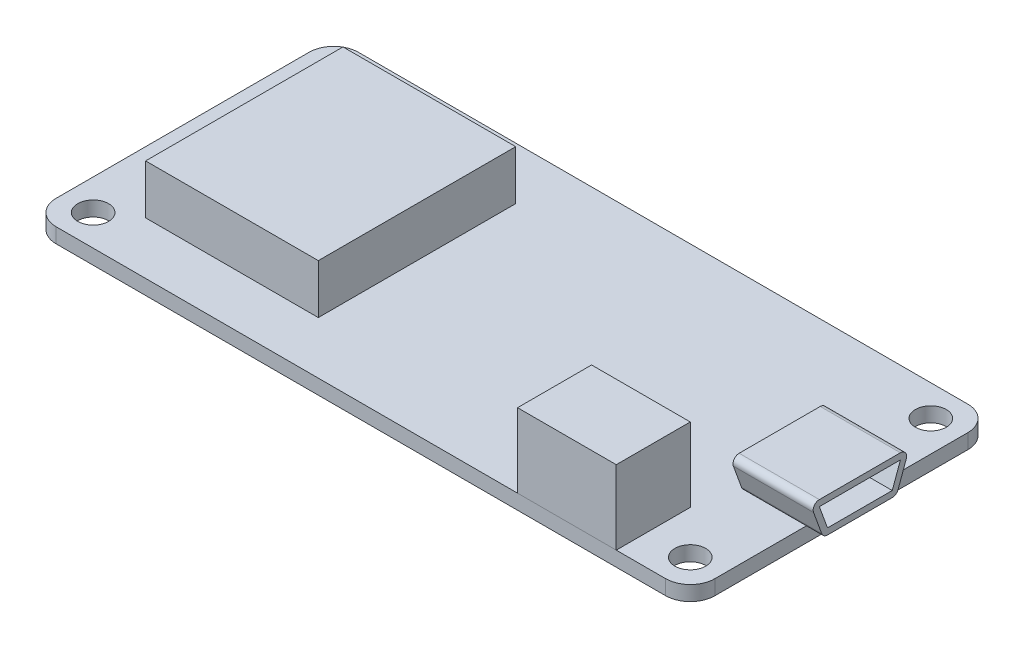
ISO-10303-21;
HEADER;
FILE_DESCRIPTION(('STEP AP214'),'2;1');
FILE_NAME('part.step','',(''),(''),'','','');
FILE_SCHEMA(('AUTOMOTIVE_DESIGN { 1 0 10303 214 1 1 1 1 }'));
ENDSEC;
DATA;
#1=APPLICATION_CONTEXT('core data for automotive mechanical design processes');
#2=APPLICATION_PROTOCOL_DEFINITION('international standard','automotive_design',2000,#1);
#3=PRODUCT_CONTEXT('',#1,'mechanical');
#4=PRODUCT('Part','Part','',(#3));
#5=PRODUCT_RELATED_PRODUCT_CATEGORY('part','',(#4));
#6=PRODUCT_DEFINITION_FORMATION('','',#4);
#7=PRODUCT_DEFINITION_CONTEXT('part definition',#1,'design');
#8=PRODUCT_DEFINITION('design','',#6,#7);
#9=PRODUCT_DEFINITION_SHAPE('','',#8);
#10=(LENGTH_UNIT() NAMED_UNIT(*) SI_UNIT(.MILLI.,.METRE.));
#11=(NAMED_UNIT(*) PLANE_ANGLE_UNIT() SI_UNIT($,.RADIAN.));
#12=(NAMED_UNIT(*) SI_UNIT($,.STERADIAN.) SOLID_ANGLE_UNIT());
#13=UNCERTAINTY_MEASURE_WITH_UNIT(LENGTH_MEASURE(1.E-05),#10,'distance_accuracy_value','');
#14=(GEOMETRIC_REPRESENTATION_CONTEXT(3) GLOBAL_UNCERTAINTY_ASSIGNED_CONTEXT((#13)) GLOBAL_UNIT_ASSIGNED_CONTEXT((#10,
#11,#12)) REPRESENTATION_CONTEXT('',''));
#15=CARTESIAN_POINT('',(0.,0.,0.));
#16=DIRECTION('',(0.,0.,1.));
#17=DIRECTION('',(1.,0.,0.));
#18=AXIS2_PLACEMENT_3D('',#15,#16,#17);
#19=CARTESIAN_POINT('',(47.4,7.2,0.));
#20=DIRECTION('',(-1.,0.,0.));
#21=DIRECTION('',(0.,0.,1.));
#22=AXIS2_PLACEMENT_3D('',#19,#20,#21);
#23=PLANE('',#22);
#24=DIRECTION('',(0.,0.,-1.));
#25=VECTOR('',#24,1.);
#26=CARTESIAN_POINT('',(47.4,1.2,0.));
#27=LINE('',#26,#25);
#28=CARTESIAN_POINT('',(47.4,1.2,0.));
#29=VERTEX_POINT('',#28);
#30=CARTESIAN_POINT('',(47.4,1.2,-6.));
#31=VERTEX_POINT('',#30);
#32=EDGE_CURVE('E110',#29,#31,#27,.T.);
#33=ORIENTED_EDGE('',*,*,#32,.T.);
#34=DIRECTION('',(0.,-1.,0.));
#35=VECTOR('',#34,1.);
#36=CARTESIAN_POINT('',(47.4,7.2,-6.));
#37=LINE('',#36,#35);
#38=CARTESIAN_POINT('',(47.4,7.2,-6.));
#39=VERTEX_POINT('',#38);
#40=EDGE_CURVE('E12',#39,#31,#37,.T.);
#41=ORIENTED_EDGE('',*,*,#40,.F.);
#42=DIRECTION('',(0.,0.,-1.));
#43=VECTOR('',#42,1.);
#44=CARTESIAN_POINT('',(47.4,7.2,0.));
#45=LINE('',#44,#43);
#46=CARTESIAN_POINT('',(47.4,7.2,0.));
#47=VERTEX_POINT('',#46);
#48=EDGE_CURVE('E98',#47,#39,#45,.T.);
#49=ORIENTED_EDGE('',*,*,#48,.F.);
#50=DIRECTION('',(0.,-1.,0.));
#51=VECTOR('',#50,1.);
#52=CARTESIAN_POINT('',(47.4,7.2,0.));
#53=LINE('',#52,#51);
#54=EDGE_CURVE('E106',#47,#29,#53,.T.);
#55=ORIENTED_EDGE('',*,*,#54,.T.);
#56=EDGE_LOOP('',(#33,#41,#49,#55));
#57=FACE_BOUND('',#56,.T.);
#58=ADVANCED_FACE('F47',(#57),#23,.F.);
#59=CARTESIAN_POINT('',(47.4,7.2,-6.));
#60=DIRECTION('',(0.,0.,1.));
#61=DIRECTION('',(1.,0.,0.));
#62=AXIS2_PLACEMENT_3D('',#59,#60,#61);
#63=PLANE('',#62);
#64=DIRECTION('',(-1.,0.,0.));
#65=VECTOR('',#64,1.);
#66=CARTESIAN_POINT('',(47.4,1.2,-6.));
#67=LINE('',#66,#65);
#68=CARTESIAN_POINT('',(39.4,1.2,-6.));
#69=VERTEX_POINT('',#68);
#70=EDGE_CURVE('E102',#31,#69,#67,.T.);
#71=ORIENTED_EDGE('',*,*,#70,.T.);
#72=DIRECTION('',(0.,-1.,0.));
#73=VECTOR('',#72,1.);
#74=CARTESIAN_POINT('',(39.4,7.2,-6.));
#75=LINE('',#74,#73);
#76=CARTESIAN_POINT('',(39.4,7.2,-6.));
#77=VERTEX_POINT('',#76);
#78=EDGE_CURVE('E55',#77,#69,#75,.T.);
#79=ORIENTED_EDGE('',*,*,#78,.F.);
#80=DIRECTION('',(-1.,0.,0.));
#81=VECTOR('',#80,1.);
#82=CARTESIAN_POINT('',(47.4,7.2,-6.));
#83=LINE('',#82,#81);
#84=EDGE_CURVE('E93',#39,#77,#83,.T.);
#85=ORIENTED_EDGE('',*,*,#84,.F.);
#86=ORIENTED_EDGE('',*,*,#40,.T.);
#87=EDGE_LOOP('',(#71,#79,#85,#86));
#88=FACE_BOUND('',#87,.T.);
#89=ADVANCED_FACE('F101',(#88),#63,.F.);
#90=CARTESIAN_POINT('',(39.4,7.2,0.));
#91=DIRECTION('',(1.,0.,0.));
#92=DIRECTION('',(0.,0.,-1.));
#93=AXIS2_PLACEMENT_3D('',#90,#91,#92);
#94=PLANE('',#93);
#95=DIRECTION('',(0.,0.,1.));
#96=VECTOR('',#95,1.);
#97=CARTESIAN_POINT('',(39.4,1.2,0.));
#98=LINE('',#97,#96);
#99=CARTESIAN_POINT('',(39.4,1.2,0.));
#100=VERTEX_POINT('',#99);
#101=EDGE_CURVE('E80',#69,#100,#98,.T.);
#102=ORIENTED_EDGE('',*,*,#101,.T.);
#103=DIRECTION('',(0.,-1.,0.));
#104=VECTOR('',#103,1.);
#105=CARTESIAN_POINT('',(39.4,7.2,0.));
#106=LINE('',#105,#104);
#107=CARTESIAN_POINT('',(39.4,7.2,0.));
#108=VERTEX_POINT('',#107);
#109=EDGE_CURVE('E103',#108,#100,#106,.T.);
#110=ORIENTED_EDGE('',*,*,#109,.F.);
#111=DIRECTION('',(0.,0.,1.));
#112=VECTOR('',#111,1.);
#113=CARTESIAN_POINT('',(39.4,7.2,0.));
#114=LINE('',#113,#112);
#115=EDGE_CURVE('E96',#77,#108,#114,.T.);
#116=ORIENTED_EDGE('',*,*,#115,.F.);
#117=ORIENTED_EDGE('',*,*,#78,.T.);
#118=EDGE_LOOP('',(#102,#110,#116,#117));
#119=FACE_BOUND('',#118,.T.);
#120=ADVANCED_FACE('F104',(#119),#94,.F.);
#121=CARTESIAN_POINT('',(47.4,7.2,0.));
#122=DIRECTION('',(0.,0.,-1.));
#123=DIRECTION('',(-1.,0.,0.));
#124=AXIS2_PLACEMENT_3D('',#121,#122,#123);
#125=PLANE('',#124);
#126=DIRECTION('',(1.,0.,0.));
#127=VECTOR('',#126,1.);
#128=CARTESIAN_POINT('',(47.4,1.2,0.));
#129=LINE('',#128,#127);
#130=EDGE_CURVE('E86',#100,#29,#129,.T.);
#131=ORIENTED_EDGE('',*,*,#130,.T.);
#132=ORIENTED_EDGE('',*,*,#54,.F.);
#133=DIRECTION('',(1.,0.,0.));
#134=VECTOR('',#133,1.);
#135=CARTESIAN_POINT('',(47.4,7.2,0.));
#136=LINE('',#135,#134);
#137=EDGE_CURVE('E63',#108,#47,#136,.T.);
#138=ORIENTED_EDGE('',*,*,#137,.F.);
#139=ORIENTED_EDGE('',*,*,#109,.T.);
#140=EDGE_LOOP('',(#131,#132,#138,#139));
#141=FACE_BOUND('',#140,.T.);
#142=ADVANCED_FACE('F117',(#141),#125,.F.);
#143=CARTESIAN_POINT('',(0.,7.2,0.));
#144=DIRECTION('',(0.,1.,0.));
#145=DIRECTION('',(0.,0.,1.));
#146=AXIS2_PLACEMENT_3D('',#143,#144,#145);
#147=PLANE('',#146);
#148=ORIENTED_EDGE('',*,*,#48,.T.);
#149=ORIENTED_EDGE('',*,*,#84,.T.);
#150=ORIENTED_EDGE('',*,*,#115,.T.);
#151=ORIENTED_EDGE('',*,*,#137,.T.);
#152=EDGE_LOOP('',(#148,#149,#150,#151));
#153=FACE_BOUND('',#152,.T.);
#154=ADVANCED_FACE('F94',(#153),#147,.T.);
#155=CARTESIAN_POINT('',(0.,1.2,0.));
#156=DIRECTION('',(0.,1.,0.));
#157=DIRECTION('',(0.,0.,1.));
#158=AXIS2_PLACEMENT_3D('',#155,#156,#157);
#159=PLANE('',#158);
#160=ORIENTED_EDGE('',*,*,#32,.F.);
#161=ORIENTED_EDGE('',*,*,#130,.F.);
#162=ORIENTED_EDGE('',*,*,#101,.F.);
#163=ORIENTED_EDGE('',*,*,#70,.F.);
#164=EDGE_LOOP('',(#160,#161,#162,#163));
#165=FACE_BOUND('',#164,.T.);
#166=ADVANCED_FACE('F120',(#165),#159,.F.);
#167=CLOSED_SHELL('',(#58,#89,#120,#142,#154,#166));
#168=MANIFOLD_SOLID_BREP('B2',#167);
#169=CARTESIAN_POINT('',(5.,5.2,-20.25));
#170=DIRECTION('',(1.,0.,0.));
#171=DIRECTION('',(0.,0.,-1.));
#172=AXIS2_PLACEMENT_3D('',#169,#170,#171);
#173=PLANE('',#172);
#174=DIRECTION('',(0.,0.,1.));
#175=VECTOR('',#174,1.);
#176=CARTESIAN_POINT('',(5.,1.2,-20.25));
#177=LINE('',#176,#175);
#178=CARTESIAN_POINT('',(5.,1.2,-20.25));
#179=VERTEX_POINT('',#178);
#180=CARTESIAN_POINT('',(5.,1.2,-4.25));
#181=VERTEX_POINT('',#180);
#182=EDGE_CURVE('E255',#179,#181,#177,.T.);
#183=ORIENTED_EDGE('',*,*,#182,.T.);
#184=DIRECTION('',(0.,-1.,0.));
#185=VECTOR('',#184,1.);
#186=CARTESIAN_POINT('',(5.,5.2,-4.25));
#187=LINE('',#186,#185);
#188=CARTESIAN_POINT('',(5.,5.2,-4.25));
#189=VERTEX_POINT('',#188);
#190=EDGE_CURVE('E45',#189,#181,#187,.T.);
#191=ORIENTED_EDGE('',*,*,#190,.F.);
#192=DIRECTION('',(0.,0.,1.));
#193=VECTOR('',#192,1.);
#194=CARTESIAN_POINT('',(5.,5.2,-20.25));
#195=LINE('',#194,#193);
#196=CARTESIAN_POINT('',(5.,5.2,-20.25));
#197=VERTEX_POINT('',#196);
#198=EDGE_CURVE('E243',#197,#189,#195,.T.);
#199=ORIENTED_EDGE('',*,*,#198,.F.);
#200=DIRECTION('',(0.,-1.,0.));
#201=VECTOR('',#200,1.);
#202=CARTESIAN_POINT('',(5.,5.2,-20.25));
#203=LINE('',#202,#201);
#204=EDGE_CURVE('E251',#197,#179,#203,.T.);
#205=ORIENTED_EDGE('',*,*,#204,.T.);
#206=EDGE_LOOP('',(#183,#191,#199,#205));
#207=FACE_BOUND('',#206,.T.);
#208=ADVANCED_FACE('F192',(#207),#173,.F.);
#209=CARTESIAN_POINT('',(5.,5.2,-4.25));
#210=DIRECTION('',(0.,0.,-1.));
#211=DIRECTION('',(-1.,0.,0.));
#212=AXIS2_PLACEMENT_3D('',#209,#210,#211);
#213=PLANE('',#212);
#214=DIRECTION('',(1.,0.,0.));
#215=VECTOR('',#214,1.);
#216=CARTESIAN_POINT('',(5.,1.2,-4.25));
#217=LINE('',#216,#215);
#218=CARTESIAN_POINT('',(19.,1.2,-4.25));
#219=VERTEX_POINT('',#218);
#220=EDGE_CURVE('E247',#181,#219,#217,.T.);
#221=ORIENTED_EDGE('',*,*,#220,.T.);
#222=DIRECTION('',(0.,-1.,0.));
#223=VECTOR('',#222,1.);
#224=CARTESIAN_POINT('',(19.,5.2,-4.25));
#225=LINE('',#224,#223);
#226=CARTESIAN_POINT('',(19.,5.2,-4.25));
#227=VERTEX_POINT('',#226);
#228=EDGE_CURVE('E200',#227,#219,#225,.T.);
#229=ORIENTED_EDGE('',*,*,#228,.F.);
#230=DIRECTION('',(1.,0.,0.));
#231=VECTOR('',#230,1.);
#232=CARTESIAN_POINT('',(5.,5.2,-4.25));
#233=LINE('',#232,#231);
#234=EDGE_CURVE('E238',#189,#227,#233,.T.);
#235=ORIENTED_EDGE('',*,*,#234,.F.);
#236=ORIENTED_EDGE('',*,*,#190,.T.);
#237=EDGE_LOOP('',(#221,#229,#235,#236));
#238=FACE_BOUND('',#237,.T.);
#239=ADVANCED_FACE('F246',(#238),#213,.F.);
#240=CARTESIAN_POINT('',(19.,5.2,-20.25));
#241=DIRECTION('',(-1.,0.,0.));
#242=DIRECTION('',(0.,0.,1.));
#243=AXIS2_PLACEMENT_3D('',#240,#241,#242);
#244=PLANE('',#243);
#245=DIRECTION('',(0.,0.,-1.));
#246=VECTOR('',#245,1.);
#247=CARTESIAN_POINT('',(19.,1.2,-20.25));
#248=LINE('',#247,#246);
#249=CARTESIAN_POINT('',(19.,1.2,-20.25));
#250=VERTEX_POINT('',#249);
#251=EDGE_CURVE('E225',#219,#250,#248,.T.);
#252=ORIENTED_EDGE('',*,*,#251,.T.);
#253=DIRECTION('',(0.,-1.,0.));
#254=VECTOR('',#253,1.);
#255=CARTESIAN_POINT('',(19.,5.2,-20.25));
#256=LINE('',#255,#254);
#257=CARTESIAN_POINT('',(19.,5.2,-20.25));
#258=VERTEX_POINT('',#257);
#259=EDGE_CURVE('E248',#258,#250,#256,.T.);
#260=ORIENTED_EDGE('',*,*,#259,.F.);
#261=DIRECTION('',(0.,0.,-1.));
#262=VECTOR('',#261,1.);
#263=CARTESIAN_POINT('',(19.,5.2,-20.25));
#264=LINE('',#263,#262);
#265=EDGE_CURVE('E241',#227,#258,#264,.T.);
#266=ORIENTED_EDGE('',*,*,#265,.F.);
#267=ORIENTED_EDGE('',*,*,#228,.T.);
#268=EDGE_LOOP('',(#252,#260,#266,#267));
#269=FACE_BOUND('',#268,.T.);
#270=ADVANCED_FACE('F249',(#269),#244,.F.);
#271=CARTESIAN_POINT('',(5.,5.2,-20.25));
#272=DIRECTION('',(0.,0.,1.));
#273=DIRECTION('',(1.,0.,0.));
#274=AXIS2_PLACEMENT_3D('',#271,#272,#273);
#275=PLANE('',#274);
#276=DIRECTION('',(-1.,0.,0.));
#277=VECTOR('',#276,1.);
#278=CARTESIAN_POINT('',(5.,1.2,-20.25));
#279=LINE('',#278,#277);
#280=EDGE_CURVE('E231',#250,#179,#279,.T.);
#281=ORIENTED_EDGE('',*,*,#280,.T.);
#282=ORIENTED_EDGE('',*,*,#204,.F.);
#283=DIRECTION('',(-1.,0.,0.));
#284=VECTOR('',#283,1.);
#285=CARTESIAN_POINT('',(5.,5.2,-20.25));
#286=LINE('',#285,#284);
#287=EDGE_CURVE('E208',#258,#197,#286,.T.);
#288=ORIENTED_EDGE('',*,*,#287,.F.);
#289=ORIENTED_EDGE('',*,*,#259,.T.);
#290=EDGE_LOOP('',(#281,#282,#288,#289));
#291=FACE_BOUND('',#290,.T.);
#292=ADVANCED_FACE('F262',(#291),#275,.F.);
#293=CARTESIAN_POINT('',(0.,5.2,0.));
#294=DIRECTION('',(0.,1.,0.));
#295=DIRECTION('',(0.,0.,1.));
#296=AXIS2_PLACEMENT_3D('',#293,#294,#295);
#297=PLANE('',#296);
#298=ORIENTED_EDGE('',*,*,#198,.T.);
#299=ORIENTED_EDGE('',*,*,#234,.T.);
#300=ORIENTED_EDGE('',*,*,#265,.T.);
#301=ORIENTED_EDGE('',*,*,#287,.T.);
#302=EDGE_LOOP('',(#298,#299,#300,#301));
#303=FACE_BOUND('',#302,.T.);
#304=ADVANCED_FACE('F239',(#303),#297,.T.);
#305=CARTESIAN_POINT('',(0.,1.2,0.));
#306=DIRECTION('',(0.,1.,0.));
#307=DIRECTION('',(0.,0.,1.));
#308=AXIS2_PLACEMENT_3D('',#305,#306,#307);
#309=PLANE('',#308);
#310=ORIENTED_EDGE('',*,*,#182,.F.);
#311=ORIENTED_EDGE('',*,*,#280,.F.);
#312=ORIENTED_EDGE('',*,*,#251,.F.);
#313=ORIENTED_EDGE('',*,*,#220,.F.);
#314=EDGE_LOOP('',(#310,#311,#312,#313));
#315=FACE_BOUND('',#314,.T.);
#316=ADVANCED_FACE('F265',(#315),#309,.F.);
#317=CLOSED_SHELL('',(#208,#239,#270,#292,#304,#316));
#318=MANIFOLD_SOLID_BREP('B6',#317);
#319=CARTESIAN_POINT('',(54.9,1.7,-9.62616419908186));
#320=DIRECTION('',(1.,0.,0.));
#321=DIRECTION('',(0.,0.,-1.));
#322=AXIS2_PLACEMENT_3D('',#319,#320,#321);
#323=PLANE('',#322);
#324=CARTESIAN_POINT('',(54.9,1.7,-9.62616419908186));
#325=DIRECTION('',(1.,0.,0.));
#326=DIRECTION('',(0.,0.,-1.));
#327=AXIS2_PLACEMENT_3D('',#324,#325,#326);
#328=CIRCLE('',#327,0.5);
#329=CARTESIAN_POINT('',(54.9,1.52898992833717,-9.15631788868891));
#330=VERTEX_POINT('',#329);
#331=CARTESIAN_POINT('',(54.9,1.2,-9.62616419908186));
#332=VERTEX_POINT('',#331);
#333=EDGE_CURVE('E436',#330,#332,#328,.T.);
#334=ORIENTED_EDGE('',*,*,#333,.T.);
#335=DIRECTION('',(0.,0.,-1.));
#336=VECTOR('',#335,1.);
#337=CARTESIAN_POINT('',(54.9,1.2,-9.62616419908186));
#338=LINE('',#337,#336);
#339=CARTESIAN_POINT('',(54.9,1.2,-14.8738358009181));
#340=VERTEX_POINT('',#339);
#341=EDGE_CURVE('E491',#332,#340,#338,.T.);
#342=ORIENTED_EDGE('',*,*,#341,.T.);
#343=CARTESIAN_POINT('',(54.9,1.7,-14.8738358009181));
#344=DIRECTION('',(1.,0.,0.));
#345=DIRECTION('',(0.,0.,-1.));
#346=AXIS2_PLACEMENT_3D('',#343,#344,#345);
#347=CIRCLE('',#346,0.499999999999998);
#348=CARTESIAN_POINT('',(54.9,1.52898992833717,-15.3436821113111));
#349=VERTEX_POINT('',#348);
#350=EDGE_CURVE('E493',#340,#349,#347,.T.);
#351=ORIENTED_EDGE('',*,*,#350,.T.);
#352=DIRECTION('',(0.,0.939692620785907,-0.342020143325674));
#353=VECTOR('',#352,1.);
#354=CARTESIAN_POINT('',(54.9,3.34806779069489,-16.0057723070219));
#355=LINE('',#354,#353);
#356=CARTESIAN_POINT('',(54.9,3.34806779069489,-16.0057723070219));
#357=VERTEX_POINT('',#356);
#358=EDGE_CURVE('E495',#349,#357,#355,.T.);
#359=ORIENTED_EDGE('',*,*,#358,.T.);
#360=CARTESIAN_POINT('',(54.9,3.51907786235773,-15.5359259966289));
#361=DIRECTION('',(1.,0.,0.));
#362=DIRECTION('',(0.,0.,1.));
#363=AXIS2_PLACEMENT_3D('',#360,#361,#362);
#364=CIRCLE('',#363,0.5);
#365=CARTESIAN_POINT('',(54.9,4.01907786235773,-15.5359259966289));
#366=VERTEX_POINT('',#365);
#367=EDGE_CURVE('E497',#357,#366,#364,.T.);
#368=ORIENTED_EDGE('',*,*,#367,.T.);
#369=DIRECTION('',(0.,0.,1.));
#370=VECTOR('',#369,1.);
#371=CARTESIAN_POINT('',(54.9,4.01907786235773,-8.96407400337106));
#372=LINE('',#371,#370);
#373=CARTESIAN_POINT('',(54.9,4.01907786235773,-8.96407400337106));
#374=VERTEX_POINT('',#373);
#375=EDGE_CURVE('E499',#366,#374,#372,.T.);
#376=ORIENTED_EDGE('',*,*,#375,.T.);
#377=CARTESIAN_POINT('',(54.9,3.51907786235773,-8.96407400337106));
#378=DIRECTION('',(1.,0.,0.));
#379=DIRECTION('',(0.,0.,-1.));
#380=AXIS2_PLACEMENT_3D('',#377,#378,#379);
#381=CIRCLE('',#380,0.499999999999999);
#382=CARTESIAN_POINT('',(54.9,3.3480677906949,-8.49422769297811));
#383=VERTEX_POINT('',#382);
#384=EDGE_CURVE('E501',#374,#383,#381,.T.);
#385=ORIENTED_EDGE('',*,*,#384,.T.);
#386=DIRECTION('',(0.,-0.93969262078591,-0.342020143325666));
#387=VECTOR('',#386,1.);
#388=CARTESIAN_POINT('',(54.9,3.3480677906949,-8.49422769297811));
#389=LINE('',#388,#387);
#390=EDGE_CURVE('E359',#383,#330,#389,.T.);
#391=ORIENTED_EDGE('',*,*,#390,.T.);
#392=EDGE_LOOP('',(#334,#342,#351,#359,#368,#376,#385,#391));
#393=FACE_BOUND('',#392,.T.);
#394=DIRECTION('',(0.,0.,-1.));
#395=VECTOR('',#394,1.);
#396=CARTESIAN_POINT('',(54.9,1.7,-9.62616419908186));
#397=LINE('',#396,#395);
#398=CARTESIAN_POINT('',(54.9,1.7,-9.62616419908186));
#399=VERTEX_POINT('',#398);
#400=CARTESIAN_POINT('',(54.9,1.7,-14.8738358009181));
#401=VERTEX_POINT('',#400);
#402=EDGE_CURVE('E480',#399,#401,#397,.T.);
#403=ORIENTED_EDGE('',*,*,#402,.F.);
#404=DIRECTION('',(0.,-0.93969262078591,-0.342020143325665));
#405=VECTOR('',#404,1.);
#406=CARTESIAN_POINT('',(54.9,3.51907786235773,-8.96407400337107));
#407=LINE('',#406,#405);
#408=CARTESIAN_POINT('',(54.9,3.51907786235773,-8.96407400337107));
#409=VERTEX_POINT('',#408);
#410=EDGE_CURVE('E433',#409,#399,#407,.T.);
#411=ORIENTED_EDGE('',*,*,#410,.F.);
#412=DIRECTION('',(0.,0.,1.));
#413=VECTOR('',#412,1.);
#414=CARTESIAN_POINT('',(54.9,3.51907786235773,-8.96407400337107));
#415=LINE('',#414,#413);
#416=CARTESIAN_POINT('',(54.9,3.51907786235773,-15.5359259966289));
#417=VERTEX_POINT('',#416);
#418=EDGE_CURVE('E484',#417,#409,#415,.T.);
#419=ORIENTED_EDGE('',*,*,#418,.F.);
#420=DIRECTION('',(0.,0.939692620785908,-0.34202014332567));
#421=VECTOR('',#420,1.);
#422=CARTESIAN_POINT('',(54.9,3.51907786235773,-15.5359259966289));
#423=LINE('',#422,#421);
#424=EDGE_CURVE('E482',#401,#417,#423,.T.);
#425=ORIENTED_EDGE('',*,*,#424,.F.);
#426=EDGE_LOOP('',(#403,#411,#419,#425));
#427=FACE_BOUND('',#426,.T.);
#428=ADVANCED_FACE('F336',(#393,#427),#323,.T.);
#429=CARTESIAN_POINT('',(54.9,1.7,-9.62616419908186));
#430=DIRECTION('',(-1.,0.,0.));
#431=DIRECTION('',(0.,0.,1.));
#432=AXIS2_PLACEMENT_3D('',#429,#430,#431);
#433=CYLINDRICAL_SURFACE('',#432,0.5);
#434=DIRECTION('',(-1.,0.,0.));
#435=VECTOR('',#434,1.);
#436=CARTESIAN_POINT('',(54.9,1.52898992833717,-9.15631788868891));
#437=LINE('',#436,#435);
#438=CARTESIAN_POINT('',(48.4,1.52898992833717,-9.15631788868891));
#439=VERTEX_POINT('',#438);
#440=EDGE_CURVE('E504',#330,#439,#437,.T.);
#441=ORIENTED_EDGE('',*,*,#440,.T.);
#442=CARTESIAN_POINT('',(48.4,1.7,-9.62616419908186));
#443=DIRECTION('',(1.,0.,0.));
#444=DIRECTION('',(0.,0.,-1.));
#445=AXIS2_PLACEMENT_3D('',#442,#443,#444);
#446=CIRCLE('',#445,0.5);
#447=CARTESIAN_POINT('',(48.4,1.2,-9.62616419908186));
#448=VERTEX_POINT('',#447);
#449=EDGE_CURVE('E455',#439,#448,#446,.T.);
#450=ORIENTED_EDGE('',*,*,#449,.T.);
#451=DIRECTION('',(-1.,0.,0.));
#452=VECTOR('',#451,1.);
#453=CARTESIAN_POINT('',(54.9,1.2,-9.62616419908186));
#454=LINE('',#453,#452);
#455=EDGE_CURVE('E190',#332,#448,#454,.T.);
#456=ORIENTED_EDGE('',*,*,#455,.F.);
#457=ORIENTED_EDGE('',*,*,#333,.F.);
#458=EDGE_LOOP('',(#441,#450,#456,#457));
#459=FACE_BOUND('',#458,.T.);
#460=ADVANCED_FACE('F338',(#459),#433,.T.);
#461=CARTESIAN_POINT('',(54.9,1.2,-9.62616419908186));
#462=DIRECTION('',(0.,1.,0.));
#463=DIRECTION('',(0.,0.,1.));
#464=AXIS2_PLACEMENT_3D('',#461,#462,#463);
#465=PLANE('',#464);
#466=ORIENTED_EDGE('',*,*,#455,.T.);
#467=DIRECTION('',(0.,0.,-1.));
#468=VECTOR('',#467,1.);
#469=CARTESIAN_POINT('',(48.4,1.2,-9.62616419908186));
#470=LINE('',#469,#468);
#471=CARTESIAN_POINT('',(48.4,1.2,-14.8738358009181));
#472=VERTEX_POINT('',#471);
#473=EDGE_CURVE('E458',#448,#472,#470,.T.);
#474=ORIENTED_EDGE('',*,*,#473,.T.);
#475=DIRECTION('',(-1.,0.,0.));
#476=VECTOR('',#475,1.);
#477=CARTESIAN_POINT('',(54.9,1.2,-14.8738358009181));
#478=LINE('',#477,#476);
#479=EDGE_CURVE('E344',#340,#472,#478,.T.);
#480=ORIENTED_EDGE('',*,*,#479,.F.);
#481=ORIENTED_EDGE('',*,*,#341,.F.);
#482=EDGE_LOOP('',(#466,#474,#480,#481));
#483=FACE_BOUND('',#482,.T.);
#484=ADVANCED_FACE('F526',(#483),#465,.F.);
#485=CARTESIAN_POINT('',(54.9,1.7,-14.8738358009181));
#486=DIRECTION('',(-1.,0.,0.));
#487=DIRECTION('',(0.,0.,1.));
#488=AXIS2_PLACEMENT_3D('',#485,#486,#487);
#489=CYLINDRICAL_SURFACE('',#488,0.499999999999998);
#490=ORIENTED_EDGE('',*,*,#479,.T.);
#491=CARTESIAN_POINT('',(48.4,1.7,-14.8738358009181));
#492=DIRECTION('',(1.,0.,0.));
#493=DIRECTION('',(0.,0.,-1.));
#494=AXIS2_PLACEMENT_3D('',#491,#492,#493);
#495=CIRCLE('',#494,0.499999999999998);
#496=CARTESIAN_POINT('',(48.4,1.52898992833717,-15.3436821113111));
#497=VERTEX_POINT('',#496);
#498=EDGE_CURVE('E461',#472,#497,#495,.T.);
#499=ORIENTED_EDGE('',*,*,#498,.T.);
#500=DIRECTION('',(-1.,0.,0.));
#501=VECTOR('',#500,1.);
#502=CARTESIAN_POINT('',(54.9,1.52898992833717,-15.3436821113111));
#503=LINE('',#502,#501);
#504=EDGE_CURVE('E514',#349,#497,#503,.T.);
#505=ORIENTED_EDGE('',*,*,#504,.F.);
#506=ORIENTED_EDGE('',*,*,#350,.F.);
#507=EDGE_LOOP('',(#490,#499,#505,#506));
#508=FACE_BOUND('',#507,.T.);
#509=ADVANCED_FACE('F519',(#508),#489,.T.);
#510=CARTESIAN_POINT('',(54.9,3.34806779069489,-16.0057723070219));
#511=DIRECTION('',(0.,0.342020143325674,0.939692620785907));
#512=DIRECTION('',(0.,-0.939692620785907,0.342020143325674));
#513=AXIS2_PLACEMENT_3D('',#510,#511,#512);
#514=PLANE('',#513);
#515=ORIENTED_EDGE('',*,*,#504,.T.);
#516=DIRECTION('',(0.,0.939692620785907,-0.342020143325674));
#517=VECTOR('',#516,1.);
#518=CARTESIAN_POINT('',(48.4,3.34806779069489,-16.0057723070219));
#519=LINE('',#518,#517);
#520=CARTESIAN_POINT('',(48.4,3.34806779069489,-16.0057723070219));
#521=VERTEX_POINT('',#520);
#522=EDGE_CURVE('E464',#497,#521,#519,.T.);
#523=ORIENTED_EDGE('',*,*,#522,.T.);
#524=DIRECTION('',(-1.,0.,0.));
#525=VECTOR('',#524,1.);
#526=CARTESIAN_POINT('',(54.9,3.34806779069489,-16.0057723070219));
#527=LINE('',#526,#525);
#528=EDGE_CURVE('E512',#357,#521,#527,.T.);
#529=ORIENTED_EDGE('',*,*,#528,.F.);
#530=ORIENTED_EDGE('',*,*,#358,.F.);
#531=EDGE_LOOP('',(#515,#523,#529,#530));
#532=FACE_BOUND('',#531,.T.);
#533=ADVANCED_FACE('F549',(#532),#514,.F.);
#534=CARTESIAN_POINT('',(54.9,3.51907786235773,-15.5359259966289));
#535=DIRECTION('',(-1.,0.,0.));
#536=DIRECTION('',(0.,0.,1.));
#537=AXIS2_PLACEMENT_3D('',#534,#535,#536);
#538=CYLINDRICAL_SURFACE('',#537,0.5);
#539=ORIENTED_EDGE('',*,*,#528,.T.);
#540=CARTESIAN_POINT('',(48.4,3.51907786235773,-15.5359259966289));
#541=DIRECTION('',(1.,0.,0.));
#542=DIRECTION('',(0.,0.,1.));
#543=AXIS2_PLACEMENT_3D('',#540,#541,#542);
#544=CIRCLE('',#543,0.5);
#545=CARTESIAN_POINT('',(48.4,4.01907786235773,-15.5359259966289));
#546=VERTEX_POINT('',#545);
#547=EDGE_CURVE('E467',#521,#546,#544,.T.);
#548=ORIENTED_EDGE('',*,*,#547,.T.);
#549=DIRECTION('',(-1.,0.,0.));
#550=VECTOR('',#549,1.);
#551=CARTESIAN_POINT('',(54.9,4.01907786235773,-15.5359259966289));
#552=LINE('',#551,#550);
#553=EDGE_CURVE('E510',#366,#546,#552,.T.);
#554=ORIENTED_EDGE('',*,*,#553,.F.);
#555=ORIENTED_EDGE('',*,*,#367,.F.);
#556=EDGE_LOOP('',(#539,#548,#554,#555));
#557=FACE_BOUND('',#556,.T.);
#558=ADVANCED_FACE('F546',(#557),#538,.T.);
#559=CARTESIAN_POINT('',(54.9,4.01907786235773,-8.96407400337106));
#560=DIRECTION('',(0.,-1.,0.));
#561=DIRECTION('',(0.,0.,-1.));
#562=AXIS2_PLACEMENT_3D('',#559,#560,#561);
#563=PLANE('',#562);
#564=ORIENTED_EDGE('',*,*,#553,.T.);
#565=DIRECTION('',(0.,0.,1.));
#566=VECTOR('',#565,1.);
#567=CARTESIAN_POINT('',(48.4,4.01907786235773,-8.96407400337106));
#568=LINE('',#567,#566);
#569=CARTESIAN_POINT('',(48.4,4.01907786235773,-8.96407400337106));
#570=VERTEX_POINT('',#569);
#571=EDGE_CURVE('E470',#546,#570,#568,.T.);
#572=ORIENTED_EDGE('',*,*,#571,.T.);
#573=DIRECTION('',(-1.,0.,0.));
#574=VECTOR('',#573,1.);
#575=CARTESIAN_POINT('',(54.9,4.01907786235773,-8.96407400337106));
#576=LINE('',#575,#574);
#577=EDGE_CURVE('E508',#374,#570,#576,.T.);
#578=ORIENTED_EDGE('',*,*,#577,.F.);
#579=ORIENTED_EDGE('',*,*,#375,.F.);
#580=EDGE_LOOP('',(#564,#572,#578,#579));
#581=FACE_BOUND('',#580,.T.);
#582=ADVANCED_FACE('F541',(#581),#563,.F.);
#583=CARTESIAN_POINT('',(54.9,3.51907786235773,-8.96407400337106));
#584=DIRECTION('',(-1.,0.,0.));
#585=DIRECTION('',(0.,0.,1.));
#586=AXIS2_PLACEMENT_3D('',#583,#584,#585);
#587=CYLINDRICAL_SURFACE('',#586,0.499999999999999);
#588=ORIENTED_EDGE('',*,*,#577,.T.);
#589=CARTESIAN_POINT('',(48.4,3.51907786235773,-8.96407400337106));
#590=DIRECTION('',(1.,0.,0.));
#591=DIRECTION('',(0.,0.,-1.));
#592=AXIS2_PLACEMENT_3D('',#589,#590,#591);
#593=CIRCLE('',#592,0.499999999999999);
#594=CARTESIAN_POINT('',(48.4,3.3480677906949,-8.49422769297811));
#595=VERTEX_POINT('',#594);
#596=EDGE_CURVE('E473',#570,#595,#593,.T.);
#597=ORIENTED_EDGE('',*,*,#596,.T.);
#598=DIRECTION('',(-1.,0.,0.));
#599=VECTOR('',#598,1.);
#600=CARTESIAN_POINT('',(54.9,3.3480677906949,-8.49422769297811));
#601=LINE('',#600,#599);
#602=EDGE_CURVE('E506',#383,#595,#601,.T.);
#603=ORIENTED_EDGE('',*,*,#602,.F.);
#604=ORIENTED_EDGE('',*,*,#384,.F.);
#605=EDGE_LOOP('',(#588,#597,#603,#604));
#606=FACE_BOUND('',#605,.T.);
#607=ADVANCED_FACE('F537',(#606),#587,.T.);
#608=CARTESIAN_POINT('',(54.9,3.3480677906949,-8.49422769297811));
#609=DIRECTION('',(0.,0.342020143325666,-0.939692620785909));
#610=DIRECTION('',(0.,0.93969262078591,0.342020143325666));
#611=AXIS2_PLACEMENT_3D('',#608,#609,#610);
#612=PLANE('',#611);
#613=ORIENTED_EDGE('',*,*,#602,.T.);
#614=DIRECTION('',(0.,-0.93969262078591,-0.342020143325666));
#615=VECTOR('',#614,1.);
#616=CARTESIAN_POINT('',(48.4,3.3480677906949,-8.49422769297811));
#617=LINE('',#616,#615);
#618=EDGE_CURVE('E476',#595,#439,#617,.T.);
#619=ORIENTED_EDGE('',*,*,#618,.T.);
#620=ORIENTED_EDGE('',*,*,#440,.F.);
#621=ORIENTED_EDGE('',*,*,#390,.F.);
#622=EDGE_LOOP('',(#613,#619,#620,#621));
#623=FACE_BOUND('',#622,.T.);
#624=ADVANCED_FACE('F533',(#623),#612,.F.);
#625=CARTESIAN_POINT('',(54.9,3.51907786235773,-8.96407400337107));
#626=DIRECTION('',(0.,0.342020143325665,-0.93969262078591));
#627=DIRECTION('',(0.,0.93969262078591,0.342020143325665));
#628=AXIS2_PLACEMENT_3D('',#625,#626,#627);
#629=PLANE('',#628);
#630=DIRECTION('',(-1.,0.,0.));
#631=VECTOR('',#630,1.);
#632=CARTESIAN_POINT('',(54.9,1.7,-9.62616419908186));
#633=LINE('',#632,#631);
#634=CARTESIAN_POINT('',(48.4,1.7,-9.62616419908186));
#635=VERTEX_POINT('',#634);
#636=EDGE_CURVE('E425',#399,#635,#633,.T.);
#637=ORIENTED_EDGE('',*,*,#636,.T.);
#638=DIRECTION('',(0.,-0.93969262078591,-0.342020143325665));
#639=VECTOR('',#638,1.);
#640=CARTESIAN_POINT('',(48.4,3.51907786235773,-8.96407400337107));
#641=LINE('',#640,#639);
#642=CARTESIAN_POINT('',(48.4,3.51907786235773,-8.96407400337107));
#643=VERTEX_POINT('',#642);
#644=EDGE_CURVE('E430',#643,#635,#641,.T.);
#645=ORIENTED_EDGE('',*,*,#644,.F.);
#646=DIRECTION('',(-1.,0.,0.));
#647=VECTOR('',#646,1.);
#648=CARTESIAN_POINT('',(54.9,3.51907786235773,-8.96407400337107));
#649=LINE('',#648,#647);
#650=EDGE_CURVE('E486',#409,#643,#649,.T.);
#651=ORIENTED_EDGE('',*,*,#650,.F.);
#652=ORIENTED_EDGE('',*,*,#410,.T.);
#653=EDGE_LOOP('',(#637,#645,#651,#652));
#654=FACE_BOUND('',#653,.T.);
#655=ADVANCED_FACE('F427',(#654),#629,.T.);
#656=CARTESIAN_POINT('',(54.9,1.7,-9.62616419908186));
#657=DIRECTION('',(0.,1.,0.));
#658=DIRECTION('',(0.,0.,1.));
#659=AXIS2_PLACEMENT_3D('',#656,#657,#658);
#660=PLANE('',#659);
#661=DIRECTION('',(-1.,0.,0.));
#662=VECTOR('',#661,1.);
#663=CARTESIAN_POINT('',(54.9,1.7,-14.8738358009181));
#664=LINE('',#663,#662);
#665=CARTESIAN_POINT('',(48.4,1.7,-14.8738358009181));
#666=VERTEX_POINT('',#665);
#667=EDGE_CURVE('E437',#401,#666,#664,.T.);
#668=ORIENTED_EDGE('',*,*,#667,.T.);
#669=DIRECTION('',(0.,0.,-1.));
#670=VECTOR('',#669,1.);
#671=CARTESIAN_POINT('',(48.4,1.7,-9.62616419908186));
#672=LINE('',#671,#670);
#673=EDGE_CURVE('E440',#635,#666,#672,.T.);
#674=ORIENTED_EDGE('',*,*,#673,.F.);
#675=ORIENTED_EDGE('',*,*,#636,.F.);
#676=ORIENTED_EDGE('',*,*,#402,.T.);
#677=EDGE_LOOP('',(#668,#674,#675,#676));
#678=FACE_BOUND('',#677,.T.);
#679=ADVANCED_FACE('F441',(#678),#660,.T.);
#680=CARTESIAN_POINT('',(54.9,3.51907786235773,-15.5359259966289));
#681=DIRECTION('',(0.,0.34202014332567,0.939692620785908));
#682=DIRECTION('',(0.,-0.939692620785908,0.34202014332567));
#683=AXIS2_PLACEMENT_3D('',#680,#681,#682);
#684=PLANE('',#683);
#685=DIRECTION('',(-1.,0.,0.));
#686=VECTOR('',#685,1.);
#687=CARTESIAN_POINT('',(54.9,3.51907786235773,-15.5359259966289));
#688=LINE('',#687,#686);
#689=CARTESIAN_POINT('',(48.4,3.51907786235773,-15.5359259966289));
#690=VERTEX_POINT('',#689);
#691=EDGE_CURVE('E351',#417,#690,#688,.T.);
#692=ORIENTED_EDGE('',*,*,#691,.T.);
#693=DIRECTION('',(0.,0.939692620785908,-0.34202014332567));
#694=VECTOR('',#693,1.);
#695=CARTESIAN_POINT('',(48.4,3.51907786235773,-15.5359259966289));
#696=LINE('',#695,#694);
#697=EDGE_CURVE('E446',#666,#690,#696,.T.);
#698=ORIENTED_EDGE('',*,*,#697,.F.);
#699=ORIENTED_EDGE('',*,*,#667,.F.);
#700=ORIENTED_EDGE('',*,*,#424,.T.);
#701=EDGE_LOOP('',(#692,#698,#699,#700));
#702=FACE_BOUND('',#701,.T.);
#703=ADVANCED_FACE('F557',(#702),#684,.T.);
#704=CARTESIAN_POINT('',(54.9,3.51907786235773,-8.96407400337107));
#705=DIRECTION('',(0.,-1.,0.));
#706=DIRECTION('',(0.,0.,-1.));
#707=AXIS2_PLACEMENT_3D('',#704,#705,#706);
#708=PLANE('',#707);
#709=ORIENTED_EDGE('',*,*,#650,.T.);
#710=DIRECTION('',(0.,0.,1.));
#711=VECTOR('',#710,1.);
#712=CARTESIAN_POINT('',(48.4,3.51907786235773,-8.96407400337107));
#713=LINE('',#712,#711);
#714=EDGE_CURVE('E450',#690,#643,#713,.T.);
#715=ORIENTED_EDGE('',*,*,#714,.F.);
#716=ORIENTED_EDGE('',*,*,#691,.F.);
#717=ORIENTED_EDGE('',*,*,#418,.T.);
#718=EDGE_LOOP('',(#709,#715,#716,#717));
#719=FACE_BOUND('',#718,.T.);
#720=ADVANCED_FACE('F558',(#719),#708,.T.);
#721=CARTESIAN_POINT('',(48.4,1.7,-9.62616419908186));
#722=DIRECTION('',(1.,0.,0.));
#723=DIRECTION('',(0.,0.,-1.));
#724=AXIS2_PLACEMENT_3D('',#721,#722,#723);
#725=PLANE('',#724);
#726=ORIENTED_EDGE('',*,*,#714,.T.);
#727=ORIENTED_EDGE('',*,*,#644,.T.);
#728=ORIENTED_EDGE('',*,*,#673,.T.);
#729=ORIENTED_EDGE('',*,*,#697,.T.);
#730=EDGE_LOOP('',(#726,#727,#728,#729));
#731=FACE_BOUND('',#730,.T.);
#732=ORIENTED_EDGE('',*,*,#449,.F.);
#733=ORIENTED_EDGE('',*,*,#618,.F.);
#734=ORIENTED_EDGE('',*,*,#596,.F.);
#735=ORIENTED_EDGE('',*,*,#571,.F.);
#736=ORIENTED_EDGE('',*,*,#547,.F.);
#737=ORIENTED_EDGE('',*,*,#522,.F.);
#738=ORIENTED_EDGE('',*,*,#498,.F.);
#739=ORIENTED_EDGE('',*,*,#473,.F.);
#740=EDGE_LOOP('',(#732,#733,#734,#735,#736,#737,#738,#739));
#741=FACE_BOUND('',#740,.T.);
#742=ADVANCED_FACE('F448',(#731,#741),#725,.F.);
#743=CLOSED_SHELL('',(#428,#460,#484,#509,#533,#558,#582,#607,#624,#655,#679,#703,#720,#742));
#744=MANIFOLD_SOLID_BREP('B39',#743);
#745=CARTESIAN_POINT('',(51.4,1.2,-22.5));
#746=DIRECTION('',(0.,-1.,0.));
#747=DIRECTION('',(0.,0.,-1.));
#748=AXIS2_PLACEMENT_3D('',#745,#746,#747);
#749=PLANE('',#748);
#750=CARTESIAN_POINT('',(51.4,1.2,-22.5));
#751=DIRECTION('',(0.,1.,0.));
#752=DIRECTION('',(0.,0.,-1.));
#753=AXIS2_PLACEMENT_3D('',#750,#751,#752);
#754=CIRCLE('',#753,2.);
#755=CARTESIAN_POINT('',(53.4,1.2,-22.5));
#756=VERTEX_POINT('',#755);
#757=CARTESIAN_POINT('',(51.4,1.2,-24.5));
#758=VERTEX_POINT('',#757);
#759=EDGE_CURVE('E809',#756,#758,#754,.T.);
#760=ORIENTED_EDGE('',*,*,#759,.T.);
#761=DIRECTION('',(-1.,0.,0.));
#762=VECTOR('',#761,1.);
#763=CARTESIAN_POINT('',(2.,1.2,-24.5));
#764=LINE('',#763,#762);
#765=CARTESIAN_POINT('',(2.,1.2,-24.5));
#766=VERTEX_POINT('',#765);
#767=EDGE_CURVE('E757',#758,#766,#764,.T.);
#768=ORIENTED_EDGE('',*,*,#767,.T.);
#769=CARTESIAN_POINT('',(2.,1.2,-22.5));
#770=DIRECTION('',(0.,1.,0.));
#771=DIRECTION('',(0.,0.,-1.));
#772=AXIS2_PLACEMENT_3D('',#769,#770,#771);
#773=CIRCLE('',#772,2.);
#774=CARTESIAN_POINT('',(0.,1.2,-22.5));
#775=VERTEX_POINT('',#774);
#776=EDGE_CURVE('E824',#766,#775,#773,.T.);
#777=ORIENTED_EDGE('',*,*,#776,.T.);
#778=DIRECTION('',(0.,0.,1.));
#779=VECTOR('',#778,1.);
#780=CARTESIAN_POINT('',(0.,1.2,-2.));
#781=LINE('',#780,#779);
#782=CARTESIAN_POINT('',(0.,1.2,-2.));
#783=VERTEX_POINT('',#782);
#784=EDGE_CURVE('E837',#775,#783,#781,.T.);
#785=ORIENTED_EDGE('',*,*,#784,.T.);
#786=CARTESIAN_POINT('',(2.,1.2,-2.));
#787=DIRECTION('',(0.,1.,0.));
#788=DIRECTION('',(0.,0.,-1.));
#789=AXIS2_PLACEMENT_3D('',#786,#787,#788);
#790=CIRCLE('',#789,2.);
#791=CARTESIAN_POINT('',(2.,1.2,0.));
#792=VERTEX_POINT('',#791);
#793=EDGE_CURVE('E776',#783,#792,#790,.T.);
#794=ORIENTED_EDGE('',*,*,#793,.T.);
#795=DIRECTION('',(1.,0.,0.));
#796=VECTOR('',#795,1.);
#797=CARTESIAN_POINT('',(2.,1.2,0.));
#798=LINE('',#797,#796);
#799=CARTESIAN_POINT('',(51.4,1.2,0.));
#800=VERTEX_POINT('',#799);
#801=EDGE_CURVE('E770',#792,#800,#798,.T.);
#802=ORIENTED_EDGE('',*,*,#801,.T.);
#803=CARTESIAN_POINT('',(51.4,1.2,-2.));
#804=DIRECTION('',(0.,1.,0.));
#805=DIRECTION('',(0.,0.,1.));
#806=AXIS2_PLACEMENT_3D('',#803,#804,#805);
#807=CIRCLE('',#806,2.);
#808=CARTESIAN_POINT('',(53.4,1.2,-2.));
#809=VERTEX_POINT('',#808);
#810=EDGE_CURVE('E774',#800,#809,#807,.T.);
#811=ORIENTED_EDGE('',*,*,#810,.T.);
#812=DIRECTION('',(0.,0.,-1.));
#813=VECTOR('',#812,1.);
#814=CARTESIAN_POINT('',(53.4,1.2,-2.));
#815=LINE('',#814,#813);
#816=EDGE_CURVE('E714',#809,#756,#815,.T.);
#817=ORIENTED_EDGE('',*,*,#816,.T.);
#818=EDGE_LOOP('',(#760,#768,#777,#785,#794,#802,#811,#817));
#819=FACE_BOUND('',#818,.T.);
#820=CARTESIAN_POINT('',(2.5,1.2,-22.));
#821=DIRECTION('',(0.,1.,0.));
#822=DIRECTION('',(0.,0.,1.));
#823=AXIS2_PLACEMENT_3D('',#820,#821,#822);
#824=CIRCLE('',#823,1.25);
#825=CARTESIAN_POINT('',(2.5,1.2,-20.75));
#826=VERTEX_POINT('',#825);
#827=EDGE_CURVE('E798',#826,#826,#824,.T.);
#828=ORIENTED_EDGE('',*,*,#827,.F.);
#829=EDGE_LOOP('',(#828));
#830=FACE_BOUND('',#829,.T.);
#831=CARTESIAN_POINT('',(50.9,1.2,-22.));
#832=DIRECTION('',(0.,1.,0.));
#833=DIRECTION('',(0.,0.,1.));
#834=AXIS2_PLACEMENT_3D('',#831,#832,#833);
#835=CIRCLE('',#834,1.25);
#836=CARTESIAN_POINT('',(50.9,1.2,-20.75));
#837=VERTEX_POINT('',#836);
#838=EDGE_CURVE('E846',#837,#837,#835,.T.);
#839=ORIENTED_EDGE('',*,*,#838,.F.);
#840=EDGE_LOOP('',(#839));
#841=FACE_BOUND('',#840,.T.);
#842=CARTESIAN_POINT('',(50.9,1.2,-2.5));
#843=DIRECTION('',(0.,1.,0.));
#844=DIRECTION('',(0.,0.,1.));
#845=AXIS2_PLACEMENT_3D('',#842,#843,#844);
#846=CIRCLE('',#845,1.25);
#847=CARTESIAN_POINT('',(50.9,1.2,-1.25));
#848=VERTEX_POINT('',#847);
#849=EDGE_CURVE('E852',#848,#848,#846,.T.);
#850=ORIENTED_EDGE('',*,*,#849,.F.);
#851=EDGE_LOOP('',(#850));
#852=FACE_BOUND('',#851,.T.);
#853=CARTESIAN_POINT('',(2.5,1.2,-2.5));
#854=DIRECTION('',(0.,1.,0.));
#855=DIRECTION('',(0.,0.,1.));
#856=AXIS2_PLACEMENT_3D('',#853,#854,#855);
#857=CIRCLE('',#856,1.25);
#858=CARTESIAN_POINT('',(2.5,1.2,-1.25));
#859=VERTEX_POINT('',#858);
#860=EDGE_CURVE('E858',#859,#859,#857,.T.);
#861=ORIENTED_EDGE('',*,*,#860,.F.);
#862=EDGE_LOOP('',(#861));
#863=FACE_BOUND('',#862,.T.);
#864=ADVANCED_FACE('F697',(#819,#830,#841,#852,#863),#749,.F.);
#865=CARTESIAN_POINT('',(51.4,0.,-22.5));
#866=DIRECTION('',(0.,-1.,0.));
#867=DIRECTION('',(0.,0.,-1.));
#868=AXIS2_PLACEMENT_3D('',#865,#866,#867);
#869=PLANE('',#868);
#870=CARTESIAN_POINT('',(50.9,0.,-2.5));
#871=DIRECTION('',(0.,1.,0.));
#872=DIRECTION('',(0.,0.,1.));
#873=AXIS2_PLACEMENT_3D('',#870,#871,#872);
#874=CIRCLE('',#873,1.25);
#875=CARTESIAN_POINT('',(50.9,0.,-1.25));
#876=VERTEX_POINT('',#875);
#877=EDGE_CURVE('E855',#876,#876,#874,.T.);
#878=ORIENTED_EDGE('',*,*,#877,.T.);
#879=EDGE_LOOP('',(#878));
#880=FACE_BOUND('',#879,.T.);
#881=CARTESIAN_POINT('',(2.5,0.,-22.));
#882=DIRECTION('',(0.,1.,0.));
#883=DIRECTION('',(0.,0.,1.));
#884=AXIS2_PLACEMENT_3D('',#881,#882,#883);
#885=CIRCLE('',#884,1.25);
#886=CARTESIAN_POINT('',(2.5,0.,-20.75));
#887=VERTEX_POINT('',#886);
#888=EDGE_CURVE('E843',#887,#887,#885,.T.);
#889=ORIENTED_EDGE('',*,*,#888,.T.);
#890=EDGE_LOOP('',(#889));
#891=FACE_BOUND('',#890,.T.);
#892=CARTESIAN_POINT('',(51.4,0.,-22.5));
#893=DIRECTION('',(0.,1.,0.));
#894=DIRECTION('',(0.,0.,-1.));
#895=AXIS2_PLACEMENT_3D('',#892,#893,#894);
#896=CIRCLE('',#895,2.);
#897=CARTESIAN_POINT('',(53.4,0.,-22.5));
#898=VERTEX_POINT('',#897);
#899=CARTESIAN_POINT('',(51.4,0.,-24.5));
#900=VERTEX_POINT('',#899);
#901=EDGE_CURVE('E794',#898,#900,#896,.T.);
#902=ORIENTED_EDGE('',*,*,#901,.F.);
#903=DIRECTION('',(0.,0.,-1.));
#904=VECTOR('',#903,1.);
#905=CARTESIAN_POINT('',(53.4,0.,-2.));
#906=LINE('',#905,#904);
#907=CARTESIAN_POINT('',(53.4,0.,-2.));
#908=VERTEX_POINT('',#907);
#909=EDGE_CURVE('E749',#908,#898,#906,.T.);
#910=ORIENTED_EDGE('',*,*,#909,.F.);
#911=CARTESIAN_POINT('',(51.4,0.,-2.));
#912=DIRECTION('',(0.,1.,0.));
#913=DIRECTION('',(0.,0.,1.));
#914=AXIS2_PLACEMENT_3D('',#911,#912,#913);
#915=CIRCLE('',#914,2.);
#916=CARTESIAN_POINT('',(51.4,0.,0.));
#917=VERTEX_POINT('',#916);
#918=EDGE_CURVE('E743',#917,#908,#915,.T.);
#919=ORIENTED_EDGE('',*,*,#918,.F.);
#920=DIRECTION('',(1.,0.,0.));
#921=VECTOR('',#920,1.);
#922=CARTESIAN_POINT('',(2.,0.,0.));
#923=LINE('',#922,#921);
#924=CARTESIAN_POINT('',(2.,0.,0.));
#925=VERTEX_POINT('',#924);
#926=EDGE_CURVE('E784',#925,#917,#923,.T.);
#927=ORIENTED_EDGE('',*,*,#926,.F.);
#928=CARTESIAN_POINT('',(2.,0.,-2.));
#929=DIRECTION('',(0.,1.,0.));
#930=DIRECTION('',(0.,0.,-1.));
#931=AXIS2_PLACEMENT_3D('',#928,#929,#930);
#932=CIRCLE('',#931,2.);
#933=CARTESIAN_POINT('',(0.,0.,-2.));
#934=VERTEX_POINT('',#933);
#935=EDGE_CURVE('E804',#934,#925,#932,.T.);
#936=ORIENTED_EDGE('',*,*,#935,.F.);
#937=DIRECTION('',(0.,0.,1.));
#938=VECTOR('',#937,1.);
#939=CARTESIAN_POINT('',(0.,0.,-2.));
#940=LINE('',#939,#938);
#941=CARTESIAN_POINT('',(0.,0.,-22.5));
#942=VERTEX_POINT('',#941);
#943=EDGE_CURVE('E802',#942,#934,#940,.T.);
#944=ORIENTED_EDGE('',*,*,#943,.F.);
#945=CARTESIAN_POINT('',(2.,0.,-22.5));
#946=DIRECTION('',(0.,1.,0.));
#947=DIRECTION('',(0.,0.,-1.));
#948=AXIS2_PLACEMENT_3D('',#945,#946,#947);
#949=CIRCLE('',#948,2.);
#950=CARTESIAN_POINT('',(2.,0.,-24.5));
#951=VERTEX_POINT('',#950);
#952=EDGE_CURVE('E800',#951,#942,#949,.T.);
#953=ORIENTED_EDGE('',*,*,#952,.F.);
#954=DIRECTION('',(-1.,0.,0.));
#955=VECTOR('',#954,1.);
#956=CARTESIAN_POINT('',(2.,0.,-24.5));
#957=LINE('',#956,#955);
#958=EDGE_CURVE('E797',#900,#951,#957,.T.);
#959=ORIENTED_EDGE('',*,*,#958,.F.);
#960=EDGE_LOOP('',(#902,#910,#919,#927,#936,#944,#953,#959));
#961=FACE_BOUND('',#960,.T.);
#962=CARTESIAN_POINT('',(50.9,0.,-22.));
#963=DIRECTION('',(0.,1.,0.));
#964=DIRECTION('',(0.,0.,1.));
#965=AXIS2_PLACEMENT_3D('',#962,#963,#964);
#966=CIRCLE('',#965,1.25);
#967=CARTESIAN_POINT('',(50.9,0.,-20.75));
#968=VERTEX_POINT('',#967);
#969=EDGE_CURVE('E849',#968,#968,#966,.T.);
#970=ORIENTED_EDGE('',*,*,#969,.T.);
#971=EDGE_LOOP('',(#970));
#972=FACE_BOUND('',#971,.T.);
#973=CARTESIAN_POINT('',(2.5,0.,-2.5));
#974=DIRECTION('',(0.,1.,0.));
#975=DIRECTION('',(0.,0.,1.));
#976=AXIS2_PLACEMENT_3D('',#973,#974,#975);
#977=CIRCLE('',#976,1.25);
#978=CARTESIAN_POINT('',(2.5,0.,-1.25));
#979=VERTEX_POINT('',#978);
#980=EDGE_CURVE('E861',#979,#979,#977,.T.);
#981=ORIENTED_EDGE('',*,*,#980,.T.);
#982=EDGE_LOOP('',(#981));
#983=FACE_BOUND('',#982,.T.);
#984=ADVANCED_FACE('F828',(#880,#891,#961,#972,#983),#869,.T.);
#985=CARTESIAN_POINT('',(51.4,1.2,-22.5));
#986=DIRECTION('',(0.,-1.,0.));
#987=DIRECTION('',(0.,0.,-1.));
#988=AXIS2_PLACEMENT_3D('',#985,#986,#987);
#989=CYLINDRICAL_SURFACE('',#988,2.);
#990=ORIENTED_EDGE('',*,*,#901,.T.);
#991=DIRECTION('',(0.,-1.,0.));
#992=VECTOR('',#991,1.);
#993=CARTESIAN_POINT('',(51.4,1.2,-24.5));
#994=LINE('',#993,#992);
#995=EDGE_CURVE('E334',#758,#900,#994,.T.);
#996=ORIENTED_EDGE('',*,*,#995,.F.);
#997=ORIENTED_EDGE('',*,*,#759,.F.);
#998=DIRECTION('',(0.,-1.,0.));
#999=VECTOR('',#998,1.);
#1000=CARTESIAN_POINT('',(53.4,1.2,-22.5));
#1001=LINE('',#1000,#999);
#1002=EDGE_CURVE('E790',#756,#898,#1001,.T.);
#1003=ORIENTED_EDGE('',*,*,#1002,.T.);
#1004=EDGE_LOOP('',(#990,#996,#997,#1003));
#1005=FACE_BOUND('',#1004,.T.);
#1006=ADVANCED_FACE('F699',(#1005),#989,.T.);
#1007=CARTESIAN_POINT('',(2.,1.2,-24.5));
#1008=DIRECTION('',(0.,0.,1.));
#1009=DIRECTION('',(1.,0.,0.));
#1010=AXIS2_PLACEMENT_3D('',#1007,#1008,#1009);
#1011=PLANE('',#1010);
#1012=ORIENTED_EDGE('',*,*,#958,.T.);
#1013=DIRECTION('',(0.,-1.,0.));
#1014=VECTOR('',#1013,1.);
#1015=CARTESIAN_POINT('',(2.,1.2,-24.5));
#1016=LINE('',#1015,#1014);
#1017=EDGE_CURVE('E706',#766,#951,#1016,.T.);
#1018=ORIENTED_EDGE('',*,*,#1017,.F.);
#1019=ORIENTED_EDGE('',*,*,#767,.F.);
#1020=ORIENTED_EDGE('',*,*,#995,.T.);
#1021=EDGE_LOOP('',(#1012,#1018,#1019,#1020));
#1022=FACE_BOUND('',#1021,.T.);
#1023=ADVANCED_FACE('F893',(#1022),#1011,.F.);
#1024=CARTESIAN_POINT('',(2.,1.2,-22.5));
#1025=DIRECTION('',(0.,-1.,0.));
#1026=DIRECTION('',(0.,0.,-1.));
#1027=AXIS2_PLACEMENT_3D('',#1024,#1025,#1026);
#1028=CYLINDRICAL_SURFACE('',#1027,2.);
#1029=ORIENTED_EDGE('',*,*,#952,.T.);
#1030=DIRECTION('',(0.,-1.,0.));
#1031=VECTOR('',#1030,1.);
#1032=CARTESIAN_POINT('',(0.,1.2,-22.5));
#1033=LINE('',#1032,#1031);
#1034=EDGE_CURVE('E816',#775,#942,#1033,.T.);
#1035=ORIENTED_EDGE('',*,*,#1034,.F.);
#1036=ORIENTED_EDGE('',*,*,#776,.F.);
#1037=ORIENTED_EDGE('',*,*,#1017,.T.);
#1038=EDGE_LOOP('',(#1029,#1035,#1036,#1037));
#1039=FACE_BOUND('',#1038,.T.);
#1040=ADVANCED_FACE('F822',(#1039),#1028,.T.);
#1041=CARTESIAN_POINT('',(0.,1.2,-2.));
#1042=DIRECTION('',(1.,0.,0.));
#1043=DIRECTION('',(0.,0.,-1.));
#1044=AXIS2_PLACEMENT_3D('',#1041,#1042,#1043);
#1045=PLANE('',#1044);
#1046=ORIENTED_EDGE('',*,*,#943,.T.);
#1047=DIRECTION('',(0.,-1.,0.));
#1048=VECTOR('',#1047,1.);
#1049=CARTESIAN_POINT('',(0.,1.2,-2.));
#1050=LINE('',#1049,#1048);
#1051=EDGE_CURVE('E813',#783,#934,#1050,.T.);
#1052=ORIENTED_EDGE('',*,*,#1051,.F.);
#1053=ORIENTED_EDGE('',*,*,#784,.F.);
#1054=ORIENTED_EDGE('',*,*,#1034,.T.);
#1055=EDGE_LOOP('',(#1046,#1052,#1053,#1054));
#1056=FACE_BOUND('',#1055,.T.);
#1057=ADVANCED_FACE('F833',(#1056),#1045,.F.);
#1058=CARTESIAN_POINT('',(2.,1.2,-2.));
#1059=DIRECTION('',(0.,-1.,0.));
#1060=DIRECTION('',(0.,0.,-1.));
#1061=AXIS2_PLACEMENT_3D('',#1058,#1059,#1060);
#1062=CYLINDRICAL_SURFACE('',#1061,2.);
#1063=ORIENTED_EDGE('',*,*,#935,.T.);
#1064=DIRECTION('',(0.,-1.,0.));
#1065=VECTOR('',#1064,1.);
#1066=CARTESIAN_POINT('',(2.,1.2,0.));
#1067=LINE('',#1066,#1065);
#1068=EDGE_CURVE('E785',#792,#925,#1067,.T.);
#1069=ORIENTED_EDGE('',*,*,#1068,.F.);
#1070=ORIENTED_EDGE('',*,*,#793,.F.);
#1071=ORIENTED_EDGE('',*,*,#1051,.T.);
#1072=EDGE_LOOP('',(#1063,#1069,#1070,#1071));
#1073=FACE_BOUND('',#1072,.T.);
#1074=ADVANCED_FACE('F836',(#1073),#1062,.T.);
#1075=CARTESIAN_POINT('',(2.,1.2,0.));
#1076=DIRECTION('',(0.,0.,-1.));
#1077=DIRECTION('',(-1.,0.,0.));
#1078=AXIS2_PLACEMENT_3D('',#1075,#1076,#1077);
#1079=PLANE('',#1078);
#1080=ORIENTED_EDGE('',*,*,#926,.T.);
#1081=DIRECTION('',(0.,-1.,0.));
#1082=VECTOR('',#1081,1.);
#1083=CARTESIAN_POINT('',(51.4,1.2,0.));
#1084=LINE('',#1083,#1082);
#1085=EDGE_CURVE('E781',#800,#917,#1084,.T.);
#1086=ORIENTED_EDGE('',*,*,#1085,.F.);
#1087=ORIENTED_EDGE('',*,*,#801,.F.);
#1088=ORIENTED_EDGE('',*,*,#1068,.T.);
#1089=EDGE_LOOP('',(#1080,#1086,#1087,#1088));
#1090=FACE_BOUND('',#1089,.T.);
#1091=ADVANCED_FACE('F782',(#1090),#1079,.F.);
#1092=CARTESIAN_POINT('',(51.4,1.2,-2.));
#1093=DIRECTION('',(0.,-1.,0.));
#1094=DIRECTION('',(0.,0.,-1.));
#1095=AXIS2_PLACEMENT_3D('',#1092,#1093,#1094);
#1096=CYLINDRICAL_SURFACE('',#1095,2.);
#1097=ORIENTED_EDGE('',*,*,#918,.T.);
#1098=DIRECTION('',(0.,-1.,0.));
#1099=VECTOR('',#1098,1.);
#1100=CARTESIAN_POINT('',(53.4,1.2,-2.));
#1101=LINE('',#1100,#1099);
#1102=EDGE_CURVE('E786',#809,#908,#1101,.T.);
#1103=ORIENTED_EDGE('',*,*,#1102,.F.);
#1104=ORIENTED_EDGE('',*,*,#810,.F.);
#1105=ORIENTED_EDGE('',*,*,#1085,.T.);
#1106=EDGE_LOOP('',(#1097,#1103,#1104,#1105));
#1107=FACE_BOUND('',#1106,.T.);
#1108=ADVANCED_FACE('F788',(#1107),#1096,.T.);
#1109=CARTESIAN_POINT('',(53.4,1.2,-2.));
#1110=DIRECTION('',(-1.,0.,0.));
#1111=DIRECTION('',(0.,0.,1.));
#1112=AXIS2_PLACEMENT_3D('',#1109,#1110,#1111);
#1113=PLANE('',#1112);
#1114=ORIENTED_EDGE('',*,*,#909,.T.);
#1115=ORIENTED_EDGE('',*,*,#1002,.F.);
#1116=ORIENTED_EDGE('',*,*,#816,.F.);
#1117=ORIENTED_EDGE('',*,*,#1102,.T.);
#1118=EDGE_LOOP('',(#1114,#1115,#1116,#1117));
#1119=FACE_BOUND('',#1118,.T.);
#1120=ADVANCED_FACE('F881',(#1119),#1113,.F.);
#1121=CARTESIAN_POINT('',(2.5,1.2,-22.));
#1122=DIRECTION('',(0.,-1.,0.));
#1123=DIRECTION('',(0.,0.,-1.));
#1124=AXIS2_PLACEMENT_3D('',#1121,#1122,#1123);
#1125=CYLINDRICAL_SURFACE('',#1124,1.25);
#1126=ORIENTED_EDGE('',*,*,#827,.T.);
#1127=EDGE_LOOP('',(#1126));
#1128=FACE_BOUND('',#1127,.T.);
#1129=ORIENTED_EDGE('',*,*,#888,.F.);
#1130=EDGE_LOOP('',(#1129));
#1131=FACE_BOUND('',#1130,.T.);
#1132=ADVANCED_FACE('F878',(#1128,#1131),#1125,.F.);
#1133=CARTESIAN_POINT('',(50.9,1.2,-22.));
#1134=DIRECTION('',(0.,-1.,0.));
#1135=DIRECTION('',(0.,0.,-1.));
#1136=AXIS2_PLACEMENT_3D('',#1133,#1134,#1135);
#1137=CYLINDRICAL_SURFACE('',#1136,1.25);
#1138=ORIENTED_EDGE('',*,*,#838,.T.);
#1139=EDGE_LOOP('',(#1138));
#1140=FACE_BOUND('',#1139,.T.);
#1141=ORIENTED_EDGE('',*,*,#969,.F.);
#1142=EDGE_LOOP('',(#1141));
#1143=FACE_BOUND('',#1142,.T.);
#1144=ADVANCED_FACE('F969',(#1140,#1143),#1137,.F.);
#1145=CARTESIAN_POINT('',(50.9,1.2,-2.5));
#1146=DIRECTION('',(0.,-1.,0.));
#1147=DIRECTION('',(0.,0.,-1.));
#1148=AXIS2_PLACEMENT_3D('',#1145,#1146,#1147);
#1149=CYLINDRICAL_SURFACE('',#1148,1.25);
#1150=ORIENTED_EDGE('',*,*,#849,.T.);
#1151=EDGE_LOOP('',(#1150));
#1152=FACE_BOUND('',#1151,.T.);
#1153=ORIENTED_EDGE('',*,*,#877,.F.);
#1154=EDGE_LOOP('',(#1153));
#1155=FACE_BOUND('',#1154,.T.);
#1156=ADVANCED_FACE('F978',(#1152,#1155),#1149,.F.);
#1157=CARTESIAN_POINT('',(2.5,1.2,-2.5));
#1158=DIRECTION('',(0.,-1.,0.));
#1159=DIRECTION('',(0.,0.,-1.));
#1160=AXIS2_PLACEMENT_3D('',#1157,#1158,#1159);
#1161=CYLINDRICAL_SURFACE('',#1160,1.25);
#1162=ORIENTED_EDGE('',*,*,#860,.T.);
#1163=EDGE_LOOP('',(#1162));
#1164=FACE_BOUND('',#1163,.T.);
#1165=ORIENTED_EDGE('',*,*,#980,.F.);
#1166=EDGE_LOOP('',(#1165));
#1167=FACE_BOUND('',#1166,.T.);
#1168=ADVANCED_FACE('F867',(#1164,#1167),#1161,.F.);
#1169=CLOSED_SHELL('',(#864,#984,#1006,#1023,#1040,#1057,#1074,#1091,#1108,#1120,#1132,#1144,
#1156,#1168));
#1170=MANIFOLD_SOLID_BREP('B184',#1169);
#1171=ADVANCED_BREP_SHAPE_REPRESENTATION('',(#18,#168,#318,#744,#1170),#14);
#1172=SHAPE_DEFINITION_REPRESENTATION(#9,#1171);
ENDSEC;
END-ISO-10303-21;
